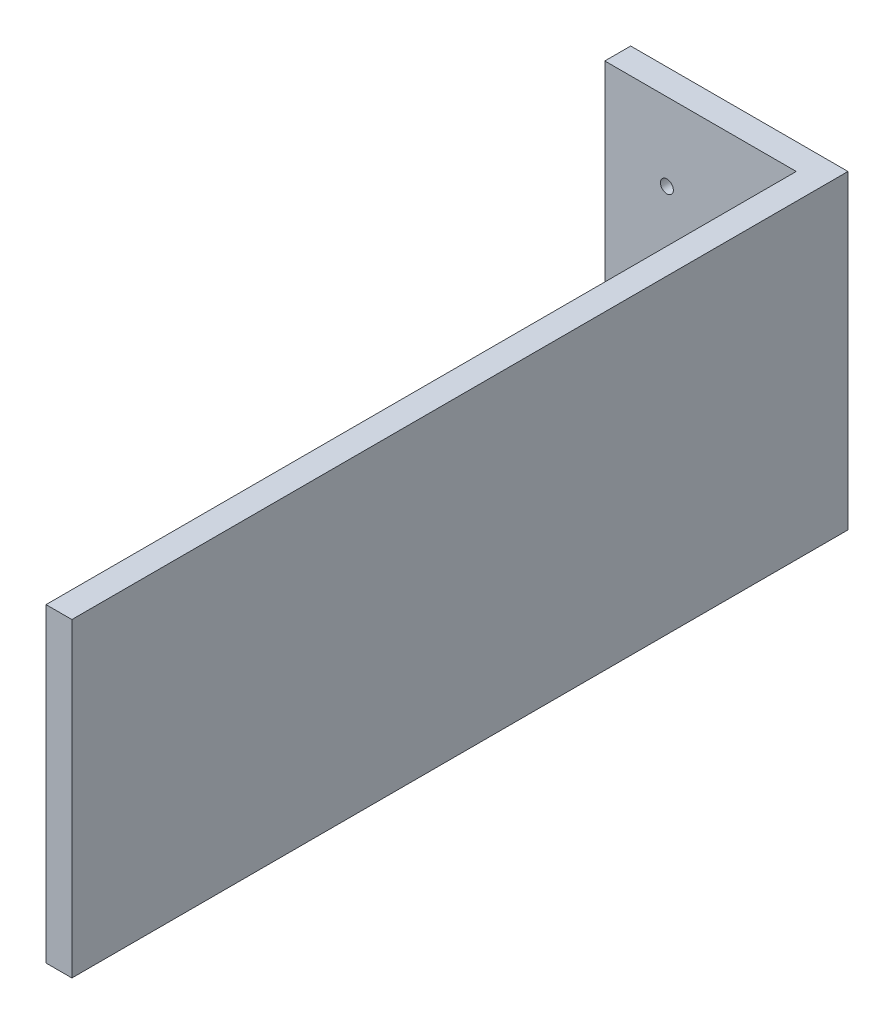
ISO-10303-21;
HEADER;
FILE_DESCRIPTION(('STEP AP214'),'2;1');
FILE_NAME('part.step','',(''),(''),'','','');
FILE_SCHEMA(('AUTOMOTIVE_DESIGN { 1 0 10303 214 1 1 1 1 }'));
ENDSEC;
DATA;
#1=APPLICATION_CONTEXT('core data for automotive mechanical design processes');
#2=APPLICATION_PROTOCOL_DEFINITION('international standard','automotive_design',2000,#1);
#3=PRODUCT_CONTEXT('',#1,'mechanical');
#4=PRODUCT('Part','Part','',(#3));
#5=PRODUCT_RELATED_PRODUCT_CATEGORY('part','',(#4));
#6=PRODUCT_DEFINITION_FORMATION('','',#4);
#7=PRODUCT_DEFINITION_CONTEXT('part definition',#1,'design');
#8=PRODUCT_DEFINITION('design','',#6,#7);
#9=PRODUCT_DEFINITION_SHAPE('','',#8);
#10=(LENGTH_UNIT() NAMED_UNIT(*) SI_UNIT(.MILLI.,.METRE.));
#11=(NAMED_UNIT(*) PLANE_ANGLE_UNIT() SI_UNIT($,.RADIAN.));
#12=(NAMED_UNIT(*) SI_UNIT($,.STERADIAN.) SOLID_ANGLE_UNIT());
#13=UNCERTAINTY_MEASURE_WITH_UNIT(LENGTH_MEASURE(1.E-05),#10,'distance_accuracy_value','');
#14=(GEOMETRIC_REPRESENTATION_CONTEXT(3) GLOBAL_UNCERTAINTY_ASSIGNED_CONTEXT((#13)) GLOBAL_UNIT_ASSIGNED_CONTEXT((#10,
#11,#12)) REPRESENTATION_CONTEXT('',''));
#15=CARTESIAN_POINT('',(0.,0.,0.));
#16=DIRECTION('',(0.,0.,1.));
#17=DIRECTION('',(1.,0.,0.));
#18=AXIS2_PLACEMENT_3D('',#15,#16,#17);
#19=CARTESIAN_POINT('',(-20.8801047139285,0.,5.));
#20=DIRECTION('',(1.,0.,0.));
#21=DIRECTION('',(0.,1.,0.));
#22=AXIS2_PLACEMENT_3D('',#19,#20,#21);
#23=PLANE('',#22);
#24=DIRECTION('',(0.,-1.,0.));
#25=VECTOR('',#24,1.);
#26=CARTESIAN_POINT('',(-20.8801047139285,0.,0.));
#27=LINE('',#26,#25);
#28=CARTESIAN_POINT('',(-20.8801047139285,30.0000000000008,0.));
#29=VERTEX_POINT('',#28);
#30=CARTESIAN_POINT('',(-20.8801047139285,-30.,0.));
#31=VERTEX_POINT('',#30);
#32=EDGE_CURVE('E99',#29,#31,#27,.T.);
#33=ORIENTED_EDGE('',*,*,#32,.T.);
#34=DIRECTION('',(0.,0.,-1.));
#35=VECTOR('',#34,1.);
#36=CARTESIAN_POINT('',(-20.8801047139285,-30.,5.));
#37=LINE('',#36,#35);
#38=CARTESIAN_POINT('',(-20.8801047139285,-30.,5.));
#39=VERTEX_POINT('',#38);
#40=EDGE_CURVE('E11',#39,#31,#37,.T.);
#41=ORIENTED_EDGE('',*,*,#40,.F.);
#42=DIRECTION('',(0.,-1.,0.));
#43=VECTOR('',#42,1.);
#44=CARTESIAN_POINT('',(-20.8801047139285,0.,5.));
#45=LINE('',#44,#43);
#46=CARTESIAN_POINT('',(-20.8801047139285,30.0000000000008,5.));
#47=VERTEX_POINT('',#46);
#48=EDGE_CURVE('E91',#47,#39,#45,.T.);
#49=ORIENTED_EDGE('',*,*,#48,.F.);
#50=DIRECTION('',(0.,0.,-1.));
#51=VECTOR('',#50,1.);
#52=CARTESIAN_POINT('',(-20.8801047139285,30.0000000000008,5.));
#53=LINE('',#52,#51);
#54=EDGE_CURVE('E46',#47,#29,#53,.T.);
#55=ORIENTED_EDGE('',*,*,#54,.T.);
#56=EDGE_LOOP('',(#33,#41,#49,#55));
#57=FACE_BOUND('',#56,.T.);
#58=ADVANCED_FACE('F37',(#57),#23,.F.);
#59=CARTESIAN_POINT('',(0.,-30.,5.));
#60=DIRECTION('',(0.,1.,0.));
#61=DIRECTION('',(-1.,0.,0.));
#62=AXIS2_PLACEMENT_3D('',#59,#60,#61);
#63=PLANE('',#62);
#64=DIRECTION('',(1.,0.,0.));
#65=VECTOR('',#64,1.);
#66=CARTESIAN_POINT('',(0.,-30.,0.));
#67=LINE('',#66,#65);
#68=CARTESIAN_POINT('',(21.1198952860715,-30.,0.));
#69=VERTEX_POINT('',#68);
#70=EDGE_CURVE('E67',#31,#69,#67,.T.);
#71=ORIENTED_EDGE('',*,*,#70,.T.);
#72=DIRECTION('',(0.,0.,-1.));
#73=VECTOR('',#72,1.);
#74=CARTESIAN_POINT('',(21.1198952860715,-30.,150.));
#75=LINE('',#74,#73);
#76=CARTESIAN_POINT('',(21.1198952860715,-30.,150.));
#77=VERTEX_POINT('',#76);
#78=EDGE_CURVE('E126',#77,#69,#75,.T.);
#79=ORIENTED_EDGE('',*,*,#78,.F.);
#80=DIRECTION('',(1.,0.,0.));
#81=VECTOR('',#80,1.);
#82=CARTESIAN_POINT('',(0.,-30.,150.));
#83=LINE('',#82,#81);
#84=CARTESIAN_POINT('',(16.1198952860715,-30.,150.));
#85=VERTEX_POINT('',#84);
#86=EDGE_CURVE('E135',#85,#77,#83,.T.);
#87=ORIENTED_EDGE('',*,*,#86,.F.);
#88=DIRECTION('',(0.,0.,-1.));
#89=VECTOR('',#88,1.);
#90=CARTESIAN_POINT('',(16.1198952860715,-30.,150.));
#91=LINE('',#90,#89);
#92=CARTESIAN_POINT('',(16.1198952860715,-30.,5.));
#93=VERTEX_POINT('',#92);
#94=EDGE_CURVE('E89',#85,#93,#91,.T.);
#95=ORIENTED_EDGE('',*,*,#94,.T.);
#96=DIRECTION('',(1.,0.,0.));
#97=VECTOR('',#96,1.);
#98=CARTESIAN_POINT('',(0.,-30.,5.));
#99=LINE('',#98,#97);
#100=EDGE_CURVE('E74',#39,#93,#99,.T.);
#101=ORIENTED_EDGE('',*,*,#100,.F.);
#102=ORIENTED_EDGE('',*,*,#40,.T.);
#103=EDGE_LOOP('',(#71,#79,#87,#95,#101,#102));
#104=FACE_BOUND('',#103,.T.);
#105=ADVANCED_FACE('F84',(#104),#63,.F.);
#106=CARTESIAN_POINT('',(5.97240511014881E-13,30.0000000000004,5.));
#107=DIRECTION('',(0.,1.,0.));
#108=DIRECTION('',(-1.,0.,0.));
#109=AXIS2_PLACEMENT_3D('',#106,#107,#108);
#110=PLANE('',#109);
#111=DIRECTION('',(1.,0.,0.));
#112=VECTOR('',#111,1.);
#113=CARTESIAN_POINT('',(5.97240511014881E-13,30.0000000000004,0.));
#114=LINE('',#113,#112);
#115=CARTESIAN_POINT('',(21.1198952860715,30.,0.));
#116=VERTEX_POINT('',#115);
#117=EDGE_CURVE('E97',#29,#116,#114,.T.);
#118=ORIENTED_EDGE('',*,*,#117,.F.);
#119=ORIENTED_EDGE('',*,*,#54,.F.);
#120=DIRECTION('',(1.,0.,0.));
#121=VECTOR('',#120,1.);
#122=CARTESIAN_POINT('',(5.97240511014881E-13,30.0000000000004,5.));
#123=LINE('',#122,#121);
#124=CARTESIAN_POINT('',(16.1198952860715,30.,5.));
#125=VERTEX_POINT('',#124);
#126=EDGE_CURVE('E95',#47,#125,#123,.T.);
#127=ORIENTED_EDGE('',*,*,#126,.T.);
#128=DIRECTION('',(0.,0.,-1.));
#129=VECTOR('',#128,1.);
#130=CARTESIAN_POINT('',(16.1198952860715,30.,150.));
#131=LINE('',#130,#129);
#132=CARTESIAN_POINT('',(16.1198952860715,30.,150.));
#133=VERTEX_POINT('',#132);
#134=EDGE_CURVE('E105',#133,#125,#131,.T.);
#135=ORIENTED_EDGE('',*,*,#134,.F.);
#136=DIRECTION('',(1.,0.,0.));
#137=VECTOR('',#136,1.);
#138=CARTESIAN_POINT('',(5.97240511014881E-13,30.0000000000004,150.));
#139=LINE('',#138,#137);
#140=CARTESIAN_POINT('',(21.1198952860715,30.,150.));
#141=VERTEX_POINT('',#140);
#142=EDGE_CURVE('E142',#133,#141,#139,.T.);
#143=ORIENTED_EDGE('',*,*,#142,.T.);
#144=DIRECTION('',(0.,0.,-1.));
#145=VECTOR('',#144,1.);
#146=CARTESIAN_POINT('',(21.1198952860715,30.,150.));
#147=LINE('',#146,#145);
#148=EDGE_CURVE('E101',#141,#116,#147,.T.);
#149=ORIENTED_EDGE('',*,*,#148,.T.);
#150=EDGE_LOOP('',(#118,#119,#127,#135,#143,#149));
#151=FACE_BOUND('',#150,.T.);
#152=ADVANCED_FACE('F116',(#151),#110,.T.);
#153=CARTESIAN_POINT('',(0.,0.,5.));
#154=DIRECTION('',(0.,0.,1.));
#155=DIRECTION('',(1.,0.,0.));
#156=AXIS2_PLACEMENT_3D('',#153,#154,#155);
#157=PLANE('',#156);
#158=CARTESIAN_POINT('',(-8.88010471392852,-15.0000000000008,5.));
#159=DIRECTION('',(0.,0.,1.));
#160=DIRECTION('',(1.,0.,0.));
#161=AXIS2_PLACEMENT_3D('',#158,#159,#160);
#162=CIRCLE('',#161,1.25);
#163=CARTESIAN_POINT('',(-7.63010471392852,-15.0000000000008,5.));
#164=VERTEX_POINT('',#163);
#165=EDGE_CURVE('E166',#164,#164,#162,.T.);
#166=ORIENTED_EDGE('',*,*,#165,.F.);
#167=EDGE_LOOP('',(#166));
#168=FACE_BOUND('',#167,.T.);
#169=CARTESIAN_POINT('',(6.11989528607148,-15.000000000001,5.));
#170=DIRECTION('',(0.,0.,1.));
#171=DIRECTION('',(1.,0.,0.));
#172=AXIS2_PLACEMENT_3D('',#169,#170,#171);
#173=CIRCLE('',#172,1.25);
#174=CARTESIAN_POINT('',(7.36989528607148,-15.000000000001,5.));
#175=VERTEX_POINT('',#174);
#176=EDGE_CURVE('E160',#175,#175,#173,.T.);
#177=ORIENTED_EDGE('',*,*,#176,.F.);
#178=EDGE_LOOP('',(#177));
#179=FACE_BOUND('',#178,.T.);
#180=CARTESIAN_POINT('',(-8.88010471392852,15.0000000000008,5.));
#181=DIRECTION('',(0.,0.,1.));
#182=DIRECTION('',(1.,0.,0.));
#183=AXIS2_PLACEMENT_3D('',#180,#181,#182);
#184=CIRCLE('',#183,1.25);
#185=CARTESIAN_POINT('',(-7.63010471392852,15.0000000000008,5.));
#186=VERTEX_POINT('',#185);
#187=EDGE_CURVE('E154',#186,#186,#184,.T.);
#188=ORIENTED_EDGE('',*,*,#187,.F.);
#189=EDGE_LOOP('',(#188));
#190=FACE_BOUND('',#189,.T.);
#191=CARTESIAN_POINT('',(6.11989528607148,15.000000000001,5.));
#192=DIRECTION('',(0.,0.,1.));
#193=DIRECTION('',(1.,0.,0.));
#194=AXIS2_PLACEMENT_3D('',#191,#192,#193);
#195=CIRCLE('',#194,1.25);
#196=CARTESIAN_POINT('',(7.36989528607148,15.000000000001,5.));
#197=VERTEX_POINT('',#196);
#198=EDGE_CURVE('E148',#197,#197,#195,.T.);
#199=ORIENTED_EDGE('',*,*,#198,.F.);
#200=EDGE_LOOP('',(#199));
#201=FACE_BOUND('',#200,.T.);
#202=ORIENTED_EDGE('',*,*,#48,.T.);
#203=ORIENTED_EDGE('',*,*,#100,.T.);
#204=DIRECTION('',(0.,-1.,0.));
#205=VECTOR('',#204,1.);
#206=CARTESIAN_POINT('',(16.1198952860715,0.,5.));
#207=LINE('',#206,#205);
#208=EDGE_CURVE('E90',#125,#93,#207,.T.);
#209=ORIENTED_EDGE('',*,*,#208,.F.);
#210=ORIENTED_EDGE('',*,*,#126,.F.);
#211=EDGE_LOOP('',(#202,#203,#209,#210));
#212=FACE_BOUND('',#211,.T.);
#213=ADVANCED_FACE('F94',(#168,#179,#190,#201,#212),#157,.T.);
#214=CARTESIAN_POINT('',(0.,0.,0.));
#215=DIRECTION('',(0.,0.,1.));
#216=DIRECTION('',(1.,0.,0.));
#217=AXIS2_PLACEMENT_3D('',#214,#215,#216);
#218=PLANE('',#217);
#219=CARTESIAN_POINT('',(-8.88010471392852,-15.0000000000008,0.));
#220=DIRECTION('',(0.,0.,1.));
#221=DIRECTION('',(1.,0.,0.));
#222=AXIS2_PLACEMENT_3D('',#219,#220,#221);
#223=CIRCLE('',#222,1.25);
#224=CARTESIAN_POINT('',(-7.63010471392852,-15.0000000000008,0.));
#225=VERTEX_POINT('',#224);
#226=EDGE_CURVE('E163',#225,#225,#223,.T.);
#227=ORIENTED_EDGE('',*,*,#226,.T.);
#228=EDGE_LOOP('',(#227));
#229=FACE_BOUND('',#228,.T.);
#230=CARTESIAN_POINT('',(6.11989528607148,-15.000000000001,0.));
#231=DIRECTION('',(0.,0.,1.));
#232=DIRECTION('',(1.,0.,0.));
#233=AXIS2_PLACEMENT_3D('',#230,#231,#232);
#234=CIRCLE('',#233,1.25);
#235=CARTESIAN_POINT('',(7.36989528607148,-15.000000000001,0.));
#236=VERTEX_POINT('',#235);
#237=EDGE_CURVE('E157',#236,#236,#234,.T.);
#238=ORIENTED_EDGE('',*,*,#237,.T.);
#239=EDGE_LOOP('',(#238));
#240=FACE_BOUND('',#239,.T.);
#241=CARTESIAN_POINT('',(-8.88010471392852,15.0000000000008,0.));
#242=DIRECTION('',(0.,0.,1.));
#243=DIRECTION('',(1.,0.,0.));
#244=AXIS2_PLACEMENT_3D('',#241,#242,#243);
#245=CIRCLE('',#244,1.25);
#246=CARTESIAN_POINT('',(-7.63010471392852,15.0000000000008,0.));
#247=VERTEX_POINT('',#246);
#248=EDGE_CURVE('E151',#247,#247,#245,.T.);
#249=ORIENTED_EDGE('',*,*,#248,.T.);
#250=EDGE_LOOP('',(#249));
#251=FACE_BOUND('',#250,.T.);
#252=CARTESIAN_POINT('',(6.11989528607148,15.000000000001,0.));
#253=DIRECTION('',(0.,0.,1.));
#254=DIRECTION('',(1.,0.,0.));
#255=AXIS2_PLACEMENT_3D('',#252,#253,#254);
#256=CIRCLE('',#255,1.25);
#257=CARTESIAN_POINT('',(7.36989528607148,15.000000000001,0.));
#258=VERTEX_POINT('',#257);
#259=EDGE_CURVE('E139',#258,#258,#256,.T.);
#260=ORIENTED_EDGE('',*,*,#259,.T.);
#261=EDGE_LOOP('',(#260));
#262=FACE_BOUND('',#261,.T.);
#263=ORIENTED_EDGE('',*,*,#32,.F.);
#264=ORIENTED_EDGE('',*,*,#117,.T.);
#265=DIRECTION('',(0.,-1.,0.));
#266=VECTOR('',#265,1.);
#267=CARTESIAN_POINT('',(21.1198952860715,0.,0.));
#268=LINE('',#267,#266);
#269=EDGE_CURVE('E136',#116,#69,#268,.T.);
#270=ORIENTED_EDGE('',*,*,#269,.T.);
#271=ORIENTED_EDGE('',*,*,#70,.F.);
#272=EDGE_LOOP('',(#263,#264,#270,#271));
#273=FACE_BOUND('',#272,.T.);
#274=ADVANCED_FACE('F174',(#229,#240,#251,#262,#273),#218,.F.);
#275=CARTESIAN_POINT('',(16.1198952860715,0.,150.));
#276=DIRECTION('',(1.,0.,0.));
#277=DIRECTION('',(0.,1.,0.));
#278=AXIS2_PLACEMENT_3D('',#275,#276,#277);
#279=PLANE('',#278);
#280=ORIENTED_EDGE('',*,*,#134,.T.);
#281=ORIENTED_EDGE('',*,*,#208,.T.);
#282=ORIENTED_EDGE('',*,*,#94,.F.);
#283=DIRECTION('',(0.,-1.,0.));
#284=VECTOR('',#283,1.);
#285=CARTESIAN_POINT('',(16.1198952860715,0.,150.));
#286=LINE('',#285,#284);
#287=EDGE_CURVE('E123',#133,#85,#286,.T.);
#288=ORIENTED_EDGE('',*,*,#287,.F.);
#289=EDGE_LOOP('',(#280,#281,#282,#288));
#290=FACE_BOUND('',#289,.T.);
#291=ADVANCED_FACE('F121',(#290),#279,.F.);
#292=CARTESIAN_POINT('',(21.1198952860715,0.,150.));
#293=DIRECTION('',(1.,0.,0.));
#294=DIRECTION('',(0.,1.,0.));
#295=AXIS2_PLACEMENT_3D('',#292,#293,#294);
#296=PLANE('',#295);
#297=ORIENTED_EDGE('',*,*,#269,.F.);
#298=ORIENTED_EDGE('',*,*,#148,.F.);
#299=DIRECTION('',(0.,-1.,0.));
#300=VECTOR('',#299,1.);
#301=CARTESIAN_POINT('',(21.1198952860715,0.,150.));
#302=LINE('',#301,#300);
#303=EDGE_CURVE('E138',#141,#77,#302,.T.);
#304=ORIENTED_EDGE('',*,*,#303,.T.);
#305=ORIENTED_EDGE('',*,*,#78,.T.);
#306=EDGE_LOOP('',(#297,#298,#304,#305));
#307=FACE_BOUND('',#306,.T.);
#308=ADVANCED_FACE('F195',(#307),#296,.T.);
#309=CARTESIAN_POINT('',(0.,0.,150.));
#310=DIRECTION('',(0.,0.,1.));
#311=DIRECTION('',(1.,0.,0.));
#312=AXIS2_PLACEMENT_3D('',#309,#310,#311);
#313=PLANE('',#312);
#314=ORIENTED_EDGE('',*,*,#303,.F.);
#315=ORIENTED_EDGE('',*,*,#142,.F.);
#316=ORIENTED_EDGE('',*,*,#287,.T.);
#317=ORIENTED_EDGE('',*,*,#86,.T.);
#318=EDGE_LOOP('',(#314,#315,#316,#317));
#319=FACE_BOUND('',#318,.T.);
#320=ADVANCED_FACE('F185',(#319),#313,.T.);
#321=CARTESIAN_POINT('',(6.11989528607148,15.000000000001,5.));
#322=DIRECTION('',(0.,0.,1.));
#323=DIRECTION('',(1.,0.,0.));
#324=AXIS2_PLACEMENT_3D('',#321,#322,#323);
#325=CYLINDRICAL_SURFACE('',#324,1.25);
#326=ORIENTED_EDGE('',*,*,#259,.F.);
#327=EDGE_LOOP('',(#326));
#328=FACE_BOUND('',#327,.T.);
#329=ORIENTED_EDGE('',*,*,#198,.T.);
#330=EDGE_LOOP('',(#329));
#331=FACE_BOUND('',#330,.T.);
#332=ADVANCED_FACE('F182',(#328,#331),#325,.F.);
#333=CARTESIAN_POINT('',(-8.88010471392852,15.0000000000008,5.));
#334=DIRECTION('',(0.,0.,1.));
#335=DIRECTION('',(1.,0.,0.));
#336=AXIS2_PLACEMENT_3D('',#333,#334,#335);
#337=CYLINDRICAL_SURFACE('',#336,1.25);
#338=ORIENTED_EDGE('',*,*,#248,.F.);
#339=EDGE_LOOP('',(#338));
#340=FACE_BOUND('',#339,.T.);
#341=ORIENTED_EDGE('',*,*,#187,.T.);
#342=EDGE_LOOP('',(#341));
#343=FACE_BOUND('',#342,.T.);
#344=ADVANCED_FACE('F184',(#340,#343),#337,.F.);
#345=CARTESIAN_POINT('',(6.11989528607148,-15.000000000001,5.));
#346=DIRECTION('',(0.,0.,1.));
#347=DIRECTION('',(1.,0.,0.));
#348=AXIS2_PLACEMENT_3D('',#345,#346,#347);
#349=CYLINDRICAL_SURFACE('',#348,1.25);
#350=ORIENTED_EDGE('',*,*,#237,.F.);
#351=EDGE_LOOP('',(#350));
#352=FACE_BOUND('',#351,.T.);
#353=ORIENTED_EDGE('',*,*,#176,.T.);
#354=EDGE_LOOP('',(#353));
#355=FACE_BOUND('',#354,.T.);
#356=ADVANCED_FACE('F192',(#352,#355),#349,.F.);
#357=CARTESIAN_POINT('',(-8.88010471392852,-15.0000000000008,5.));
#358=DIRECTION('',(0.,0.,1.));
#359=DIRECTION('',(1.,0.,0.));
#360=AXIS2_PLACEMENT_3D('',#357,#358,#359);
#361=CYLINDRICAL_SURFACE('',#360,1.25);
#362=ORIENTED_EDGE('',*,*,#226,.F.);
#363=EDGE_LOOP('',(#362));
#364=FACE_BOUND('',#363,.T.);
#365=ORIENTED_EDGE('',*,*,#165,.T.);
#366=EDGE_LOOP('',(#365));
#367=FACE_BOUND('',#366,.T.);
#368=ADVANCED_FACE('F170',(#364,#367),#361,.F.);
#369=CLOSED_SHELL('',(#58,#105,#152,#213,#274,#291,#308,#320,#332,#344,#356,#368));
#370=MANIFOLD_SOLID_BREP('B2',#369);
#371=ADVANCED_BREP_SHAPE_REPRESENTATION('',(#18,#370),#14);
#372=SHAPE_DEFINITION_REPRESENTATION(#9,#371);
ENDSEC;
END-ISO-10303-21;
